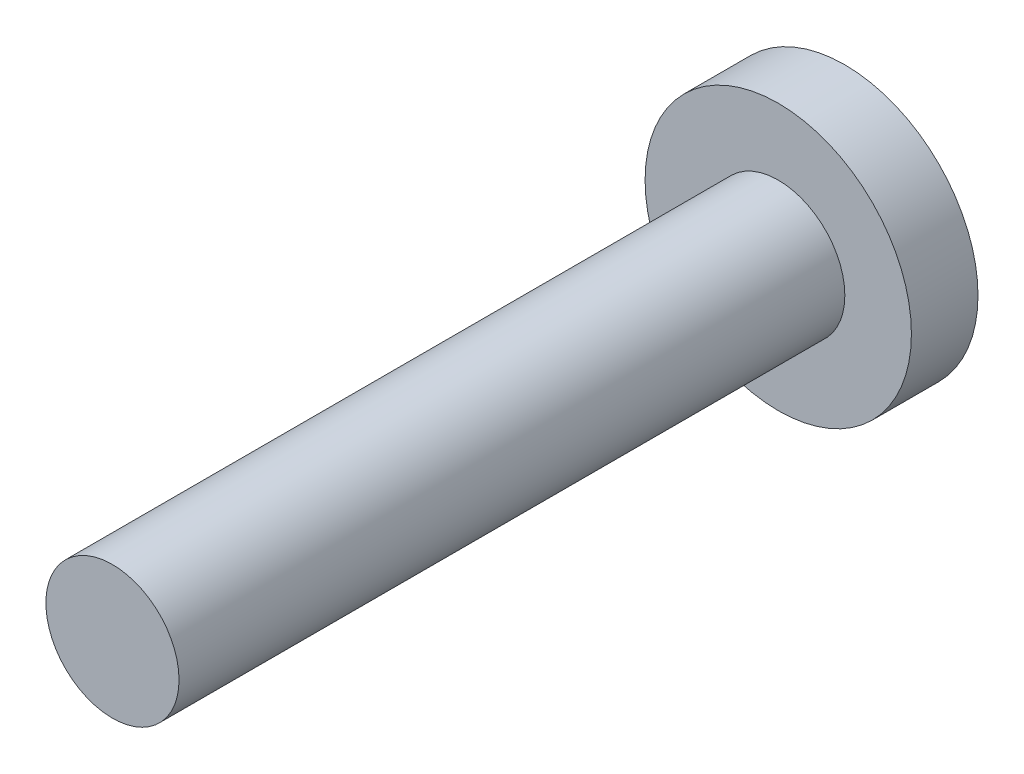
ISO-10303-21;
HEADER;
FILE_DESCRIPTION(('STEP AP214'),'2;1');
FILE_NAME('part.step','',(''),(''),'','','');
FILE_SCHEMA(('AUTOMOTIVE_DESIGN { 1 0 10303 214 1 1 1 1 }'));
ENDSEC;
DATA;
#1=APPLICATION_CONTEXT('core data for automotive mechanical design processes');
#2=APPLICATION_PROTOCOL_DEFINITION('international standard','automotive_design',2000,#1);
#3=PRODUCT_CONTEXT('',#1,'mechanical');
#4=PRODUCT('Part','Part','',(#3));
#5=PRODUCT_RELATED_PRODUCT_CATEGORY('part','',(#4));
#6=PRODUCT_DEFINITION_FORMATION('','',#4);
#7=PRODUCT_DEFINITION_CONTEXT('part definition',#1,'design');
#8=PRODUCT_DEFINITION('design','',#6,#7);
#9=PRODUCT_DEFINITION_SHAPE('','',#8);
#10=(LENGTH_UNIT() NAMED_UNIT(*) SI_UNIT(.MILLI.,.METRE.));
#11=(NAMED_UNIT(*) PLANE_ANGLE_UNIT() SI_UNIT($,.RADIAN.));
#12=(NAMED_UNIT(*) SI_UNIT($,.STERADIAN.) SOLID_ANGLE_UNIT());
#13=UNCERTAINTY_MEASURE_WITH_UNIT(LENGTH_MEASURE(1.E-05),#10,'distance_accuracy_value','');
#14=(GEOMETRIC_REPRESENTATION_CONTEXT(3) GLOBAL_UNCERTAINTY_ASSIGNED_CONTEXT((#13)) GLOBAL_UNIT_ASSIGNED_CONTEXT((#10,
#11,#12)) REPRESENTATION_CONTEXT('',''));
#15=CARTESIAN_POINT('',(0.,0.,0.));
#16=DIRECTION('',(0.,0.,1.));
#17=DIRECTION('',(1.,0.,0.));
#18=AXIS2_PLACEMENT_3D('',#15,#16,#17);
#19=CARTESIAN_POINT('',(0.,0.,2.5));
#20=DIRECTION('',(0.,0.,-1.));
#21=DIRECTION('',(-1.,0.,0.));
#22=AXIS2_PLACEMENT_3D('',#19,#20,#21);
#23=CYLINDRICAL_SURFACE('',#22,5.);
#24=CARTESIAN_POINT('',(0.,0.,2.5));
#25=DIRECTION('',(0.,0.,1.));
#26=DIRECTION('',(1.,0.,0.));
#27=AXIS2_PLACEMENT_3D('',#24,#25,#26);
#28=CIRCLE('',#27,5.);
#29=CARTESIAN_POINT('',(5.,0.,2.5));
#30=VERTEX_POINT('',#29);
#31=EDGE_CURVE('E37',#30,#30,#28,.T.);
#32=ORIENTED_EDGE('',*,*,#31,.F.);
#33=EDGE_LOOP('',(#32));
#34=FACE_BOUND('',#33,.T.);
#35=CARTESIAN_POINT('',(0.,0.,0.));
#36=DIRECTION('',(0.,0.,1.));
#37=DIRECTION('',(1.,0.,0.));
#38=AXIS2_PLACEMENT_3D('',#35,#36,#37);
#39=CIRCLE('',#38,5.);
#40=CARTESIAN_POINT('',(5.,0.,0.));
#41=VERTEX_POINT('',#40);
#42=EDGE_CURVE('E33',#41,#41,#39,.T.);
#43=ORIENTED_EDGE('',*,*,#42,.T.);
#44=EDGE_LOOP('',(#43));
#45=FACE_BOUND('',#44,.T.);
#46=ADVANCED_FACE('F30',(#34,#45),#23,.T.);
#47=CARTESIAN_POINT('',(0.,0.,2.5));
#48=DIRECTION('',(0.,0.,1.));
#49=DIRECTION('',(1.,0.,0.));
#50=AXIS2_PLACEMENT_3D('',#47,#48,#49);
#51=PLANE('',#50);
#52=CARTESIAN_POINT('',(0.,0.,2.5));
#53=DIRECTION('',(0.,0.,1.));
#54=DIRECTION('',(1.,0.,0.));
#55=AXIS2_PLACEMENT_3D('',#52,#53,#54);
#56=CIRCLE('',#55,2.5);
#57=CARTESIAN_POINT('',(2.5,0.,2.5));
#58=VERTEX_POINT('',#57);
#59=EDGE_CURVE('E10',#58,#58,#56,.T.);
#60=ORIENTED_EDGE('',*,*,#59,.F.);
#61=EDGE_LOOP('',(#60));
#62=FACE_BOUND('',#61,.T.);
#63=ORIENTED_EDGE('',*,*,#31,.T.);
#64=EDGE_LOOP('',(#63));
#65=FACE_BOUND('',#64,.T.);
#66=ADVANCED_FACE('F54',(#62,#65),#51,.T.);
#67=CARTESIAN_POINT('',(0.,0.,0.));
#68=DIRECTION('',(0.,0.,1.));
#69=DIRECTION('',(1.,0.,0.));
#70=AXIS2_PLACEMENT_3D('',#67,#68,#69);
#71=PLANE('',#70);
#72=ORIENTED_EDGE('',*,*,#42,.F.);
#73=EDGE_LOOP('',(#72));
#74=FACE_BOUND('',#73,.T.);
#75=ADVANCED_FACE('F51',(#74),#71,.F.);
#76=CARTESIAN_POINT('',(0.,0.,27.5));
#77=DIRECTION('',(0.,0.,-1.));
#78=DIRECTION('',(-1.,0.,0.));
#79=AXIS2_PLACEMENT_3D('',#76,#77,#78);
#80=CYLINDRICAL_SURFACE('',#79,2.5);
#81=CARTESIAN_POINT('',(0.,0.,27.5));
#82=DIRECTION('',(0.,0.,1.));
#83=DIRECTION('',(1.,0.,0.));
#84=AXIS2_PLACEMENT_3D('',#81,#82,#83);
#85=CIRCLE('',#84,2.5);
#86=CARTESIAN_POINT('',(2.5,0.,27.5));
#87=VERTEX_POINT('',#86);
#88=EDGE_CURVE('E43',#87,#87,#85,.T.);
#89=ORIENTED_EDGE('',*,*,#88,.F.);
#90=EDGE_LOOP('',(#89));
#91=FACE_BOUND('',#90,.T.);
#92=ORIENTED_EDGE('',*,*,#59,.T.);
#93=EDGE_LOOP('',(#92));
#94=FACE_BOUND('',#93,.T.);
#95=ADVANCED_FACE('F53',(#91,#94),#80,.T.);
#96=CARTESIAN_POINT('',(0.,0.,27.5));
#97=DIRECTION('',(0.,0.,1.));
#98=DIRECTION('',(1.,0.,0.));
#99=AXIS2_PLACEMENT_3D('',#96,#97,#98);
#100=PLANE('',#99);
#101=ORIENTED_EDGE('',*,*,#88,.T.);
#102=EDGE_LOOP('',(#101));
#103=FACE_BOUND('',#102,.T.);
#104=ADVANCED_FACE('F59',(#103),#100,.T.);
#105=CLOSED_SHELL('',(#46,#66,#75,#95,#104));
#106=MANIFOLD_SOLID_BREP('B2',#105);
#107=ADVANCED_BREP_SHAPE_REPRESENTATION('',(#18,#106),#14);
#108=SHAPE_DEFINITION_REPRESENTATION(#9,#107);
ENDSEC;
END-ISO-10303-21;
